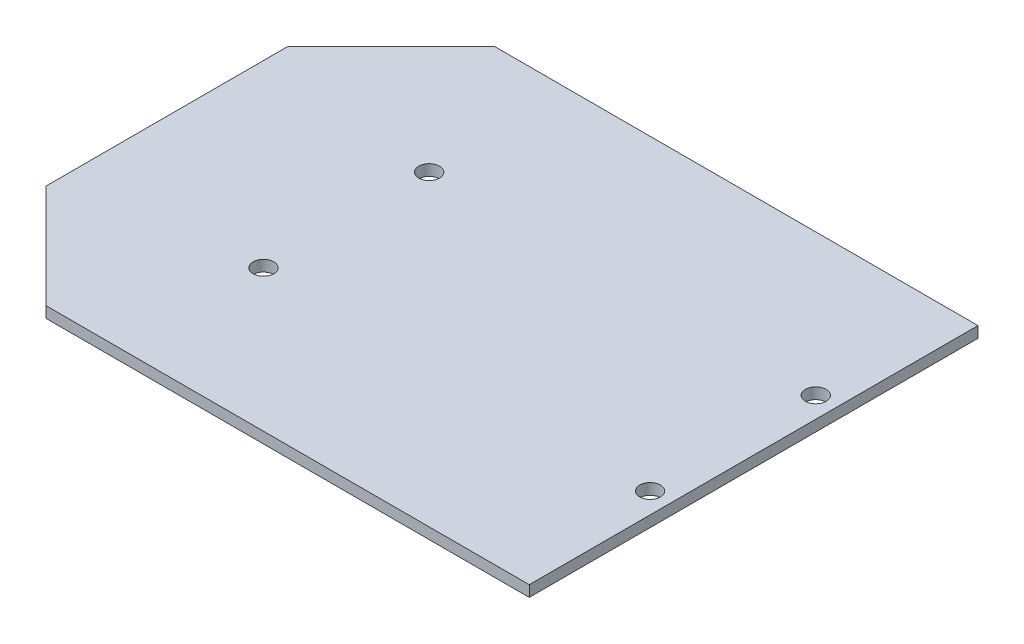
ISO-10303-21;
HEADER;
FILE_DESCRIPTION(('STEP AP214'),'2;1');
FILE_NAME('part.step','',(''),(''),'','','');
FILE_SCHEMA(('AUTOMOTIVE_DESIGN { 1 0 10303 214 1 1 1 1 }'));
ENDSEC;
DATA;
#1=APPLICATION_CONTEXT('core data for automotive mechanical design processes');
#2=APPLICATION_PROTOCOL_DEFINITION('international standard','automotive_design',2000,#1);
#3=PRODUCT_CONTEXT('',#1,'mechanical');
#4=PRODUCT('Part','Part','',(#3));
#5=PRODUCT_RELATED_PRODUCT_CATEGORY('part','',(#4));
#6=PRODUCT_DEFINITION_FORMATION('','',#4);
#7=PRODUCT_DEFINITION_CONTEXT('part definition',#1,'design');
#8=PRODUCT_DEFINITION('design','',#6,#7);
#9=PRODUCT_DEFINITION_SHAPE('','',#8);
#10=(LENGTH_UNIT() NAMED_UNIT(*) SI_UNIT(.MILLI.,.METRE.));
#11=(NAMED_UNIT(*) PLANE_ANGLE_UNIT() SI_UNIT($,.RADIAN.));
#12=(NAMED_UNIT(*) SI_UNIT($,.STERADIAN.) SOLID_ANGLE_UNIT());
#13=UNCERTAINTY_MEASURE_WITH_UNIT(LENGTH_MEASURE(1.E-05),#10,'distance_accuracy_value','');
#14=(GEOMETRIC_REPRESENTATION_CONTEXT(3) GLOBAL_UNCERTAINTY_ASSIGNED_CONTEXT((#13)) GLOBAL_UNIT_ASSIGNED_CONTEXT((#10,
#11,#12)) REPRESENTATION_CONTEXT('',''));
#15=CARTESIAN_POINT('',(0.,0.,0.));
#16=DIRECTION('',(0.,0.,1.));
#17=DIRECTION('',(1.,0.,0.));
#18=AXIS2_PLACEMENT_3D('',#15,#16,#17);
#19=CARTESIAN_POINT('',(42.5,1.6,32.5));
#20=DIRECTION('',(-1.,0.,0.));
#21=DIRECTION('',(0.,0.,1.));
#22=AXIS2_PLACEMENT_3D('',#19,#20,#21);
#23=PLANE('',#22);
#24=DIRECTION('',(0.,0.,-1.));
#25=VECTOR('',#24,1.);
#26=CARTESIAN_POINT('',(42.5,0.,32.5));
#27=LINE('',#26,#25);
#28=CARTESIAN_POINT('',(42.5,0.,32.5));
#29=VERTEX_POINT('',#28);
#30=CARTESIAN_POINT('',(42.5,0.,-32.5));
#31=VERTEX_POINT('',#30);
#32=EDGE_CURVE('E122',#29,#31,#27,.T.);
#33=ORIENTED_EDGE('',*,*,#32,.T.);
#34=DIRECTION('',(0.,-1.,0.));
#35=VECTOR('',#34,1.);
#36=CARTESIAN_POINT('',(42.5,1.6,-32.5));
#37=LINE('',#36,#35);
#38=CARTESIAN_POINT('',(42.5,1.6,-32.5));
#39=VERTEX_POINT('',#38);
#40=EDGE_CURVE('E11',#39,#31,#37,.T.);
#41=ORIENTED_EDGE('',*,*,#40,.F.);
#42=DIRECTION('',(0.,0.,-1.));
#43=VECTOR('',#42,1.);
#44=CARTESIAN_POINT('',(42.5,1.6,32.5));
#45=LINE('',#44,#43);
#46=CARTESIAN_POINT('',(42.5,1.6,32.5));
#47=VERTEX_POINT('',#46);
#48=EDGE_CURVE('E120',#47,#39,#45,.T.);
#49=ORIENTED_EDGE('',*,*,#48,.F.);
#50=DIRECTION('',(0.,-1.,0.));
#51=VECTOR('',#50,1.);
#52=CARTESIAN_POINT('',(42.5,1.6,32.5));
#53=LINE('',#52,#51);
#54=EDGE_CURVE('E49',#47,#29,#53,.T.);
#55=ORIENTED_EDGE('',*,*,#54,.T.);
#56=EDGE_LOOP('',(#33,#41,#49,#55));
#57=FACE_BOUND('',#56,.T.);
#58=ADVANCED_FACE('F41',(#57),#23,.F.);
#59=CARTESIAN_POINT('',(-42.5,1.6,-32.5));
#60=DIRECTION('',(0.,0.,1.));
#61=DIRECTION('',(1.,0.,0.));
#62=AXIS2_PLACEMENT_3D('',#59,#60,#61);
#63=PLANE('',#62);
#64=DIRECTION('',(-1.,0.,0.));
#65=VECTOR('',#64,1.);
#66=CARTESIAN_POINT('',(-42.5,0.,-32.5));
#67=LINE('',#66,#65);
#68=CARTESIAN_POINT('',(-27.5,0.,-32.5));
#69=VERTEX_POINT('',#68);
#70=EDGE_CURVE('E116',#31,#69,#67,.T.);
#71=ORIENTED_EDGE('',*,*,#70,.T.);
#72=DIRECTION('',(0.,-1.,0.));
#73=VECTOR('',#72,1.);
#74=CARTESIAN_POINT('',(-27.5,10.,-32.5));
#75=LINE('',#74,#73);
#76=CARTESIAN_POINT('',(-27.5,1.6,-32.5));
#77=VERTEX_POINT('',#76);
#78=EDGE_CURVE('E56',#77,#69,#75,.T.);
#79=ORIENTED_EDGE('',*,*,#78,.F.);
#80=DIRECTION('',(-1.,0.,0.));
#81=VECTOR('',#80,1.);
#82=CARTESIAN_POINT('',(-42.5,1.6,-32.5));
#83=LINE('',#82,#81);
#84=EDGE_CURVE('E140',#39,#77,#83,.T.);
#85=ORIENTED_EDGE('',*,*,#84,.F.);
#86=ORIENTED_EDGE('',*,*,#40,.T.);
#87=EDGE_LOOP('',(#71,#79,#85,#86));
#88=FACE_BOUND('',#87,.T.);
#89=ADVANCED_FACE('F157',(#88),#63,.F.);
#90=CARTESIAN_POINT('',(-42.5,1.6,32.5));
#91=DIRECTION('',(1.,0.,0.));
#92=DIRECTION('',(0.,0.,-1.));
#93=AXIS2_PLACEMENT_3D('',#90,#91,#92);
#94=PLANE('',#93);
#95=DIRECTION('',(0.,0.,1.));
#96=VECTOR('',#95,1.);
#97=CARTESIAN_POINT('',(-42.5,1.6,32.5));
#98=LINE('',#97,#96);
#99=CARTESIAN_POINT('',(-42.5,1.6,-17.5));
#100=VERTEX_POINT('',#99);
#101=CARTESIAN_POINT('',(-42.5,1.6,17.5));
#102=VERTEX_POINT('',#101);
#103=EDGE_CURVE('E107',#100,#102,#98,.T.);
#104=ORIENTED_EDGE('',*,*,#103,.F.);
#105=DIRECTION('',(0.,-1.,0.));
#106=VECTOR('',#105,1.);
#107=CARTESIAN_POINT('',(-42.5,10.,-17.5));
#108=LINE('',#107,#106);
#109=CARTESIAN_POINT('',(-42.5,0.,-17.5));
#110=VERTEX_POINT('',#109);
#111=EDGE_CURVE('E94',#100,#110,#108,.T.);
#112=ORIENTED_EDGE('',*,*,#111,.T.);
#113=DIRECTION('',(0.,0.,1.));
#114=VECTOR('',#113,1.);
#115=CARTESIAN_POINT('',(-42.5,0.,32.5));
#116=LINE('',#115,#114);
#117=CARTESIAN_POINT('',(-42.5,0.,17.5));
#118=VERTEX_POINT('',#117);
#119=EDGE_CURVE('E105',#110,#118,#116,.T.);
#120=ORIENTED_EDGE('',*,*,#119,.T.);
#121=DIRECTION('',(0.,-1.,0.));
#122=VECTOR('',#121,1.);
#123=CARTESIAN_POINT('',(-42.5,10.,17.5));
#124=LINE('',#123,#122);
#125=EDGE_CURVE('E64',#102,#118,#124,.T.);
#126=ORIENTED_EDGE('',*,*,#125,.F.);
#127=EDGE_LOOP('',(#104,#112,#120,#126));
#128=FACE_BOUND('',#127,.T.);
#129=ADVANCED_FACE('F104',(#128),#94,.F.);
#130=CARTESIAN_POINT('',(-42.5,1.6,32.5));
#131=DIRECTION('',(0.,0.,-1.));
#132=DIRECTION('',(-1.,0.,0.));
#133=AXIS2_PLACEMENT_3D('',#130,#131,#132);
#134=PLANE('',#133);
#135=DIRECTION('',(1.,0.,0.));
#136=VECTOR('',#135,1.);
#137=CARTESIAN_POINT('',(-42.5,1.6,32.5));
#138=LINE('',#137,#136);
#139=CARTESIAN_POINT('',(-27.5,1.6,32.5));
#140=VERTEX_POINT('',#139);
#141=EDGE_CURVE('E127',#140,#47,#138,.T.);
#142=ORIENTED_EDGE('',*,*,#141,.F.);
#143=DIRECTION('',(0.,-1.,0.));
#144=VECTOR('',#143,1.);
#145=CARTESIAN_POINT('',(-27.5,10.,32.5));
#146=LINE('',#145,#144);
#147=CARTESIAN_POINT('',(-27.5,0.,32.5));
#148=VERTEX_POINT('',#147);
#149=EDGE_CURVE('E163',#140,#148,#146,.T.);
#150=ORIENTED_EDGE('',*,*,#149,.T.);
#151=DIRECTION('',(1.,0.,0.));
#152=VECTOR('',#151,1.);
#153=CARTESIAN_POINT('',(-42.5,0.,32.5));
#154=LINE('',#153,#152);
#155=EDGE_CURVE('E115',#148,#29,#154,.T.);
#156=ORIENTED_EDGE('',*,*,#155,.T.);
#157=ORIENTED_EDGE('',*,*,#54,.F.);
#158=EDGE_LOOP('',(#142,#150,#156,#157));
#159=FACE_BOUND('',#158,.T.);
#160=ADVANCED_FACE('F169',(#159),#134,.F.);
#161=CARTESIAN_POINT('',(0.,1.6,0.));
#162=DIRECTION('',(0.,-1.,0.));
#163=DIRECTION('',(0.,0.,-1.));
#164=AXIS2_PLACEMENT_3D('',#161,#162,#163);
#165=PLANE('',#164);
#166=CARTESIAN_POINT('',(-16.5,1.6,-12.));
#167=DIRECTION('',(0.,-1.,0.));
#168=DIRECTION('',(0.,0.,-1.));
#169=AXIS2_PLACEMENT_3D('',#166,#167,#168);
#170=CIRCLE('',#169,1.49999999999999);
#171=CARTESIAN_POINT('',(-16.5,1.6,-13.5));
#172=VERTEX_POINT('',#171);
#173=EDGE_CURVE('E164',#172,#172,#170,.T.);
#174=ORIENTED_EDGE('',*,*,#173,.T.);
#175=EDGE_LOOP('',(#174));
#176=FACE_BOUND('',#175,.T.);
#177=CARTESIAN_POINT('',(39.5,1.6,-12.));
#178=DIRECTION('',(0.,-1.,0.));
#179=DIRECTION('',(0.,0.,-1.));
#180=AXIS2_PLACEMENT_3D('',#177,#178,#179);
#181=CIRCLE('',#180,1.5);
#182=CARTESIAN_POINT('',(39.5,1.6,-13.5));
#183=VERTEX_POINT('',#182);
#184=EDGE_CURVE('E202',#183,#183,#181,.T.);
#185=ORIENTED_EDGE('',*,*,#184,.T.);
#186=EDGE_LOOP('',(#185));
#187=FACE_BOUND('',#186,.T.);
#188=CARTESIAN_POINT('',(39.5000000000004,1.6,12.));
#189=DIRECTION('',(0.,-1.,0.));
#190=DIRECTION('',(0.,0.,-1.));
#191=AXIS2_PLACEMENT_3D('',#188,#189,#190);
#192=CIRCLE('',#191,1.5);
#193=CARTESIAN_POINT('',(39.5000000000004,1.6,10.5));
#194=VERTEX_POINT('',#193);
#195=EDGE_CURVE('E206',#194,#194,#192,.T.);
#196=ORIENTED_EDGE('',*,*,#195,.T.);
#197=EDGE_LOOP('',(#196));
#198=FACE_BOUND('',#197,.T.);
#199=CARTESIAN_POINT('',(-16.5,1.6,12.));
#200=DIRECTION('',(0.,-1.,0.));
#201=DIRECTION('',(0.,0.,-1.));
#202=AXIS2_PLACEMENT_3D('',#199,#200,#201);
#203=CIRCLE('',#202,1.49999999999999);
#204=CARTESIAN_POINT('',(-16.5,1.6,10.5));
#205=VERTEX_POINT('',#204);
#206=EDGE_CURVE('E209',#205,#205,#203,.T.);
#207=ORIENTED_EDGE('',*,*,#206,.T.);
#208=EDGE_LOOP('',(#207));
#209=FACE_BOUND('',#208,.T.);
#210=ORIENTED_EDGE('',*,*,#84,.T.);
#211=DIRECTION('',(-0.707106781186548,0.,0.707106781186548));
#212=VECTOR('',#211,1.);
#213=CARTESIAN_POINT('',(-30.,1.6,-30.));
#214=LINE('',#213,#212);
#215=EDGE_CURVE('E144',#77,#100,#214,.T.);
#216=ORIENTED_EDGE('',*,*,#215,.T.);
#217=ORIENTED_EDGE('',*,*,#103,.T.);
#218=DIRECTION('',(0.707106781186548,0.,0.707106781186548));
#219=VECTOR('',#218,1.);
#220=CARTESIAN_POINT('',(-30.,1.6,30.));
#221=LINE('',#220,#219);
#222=EDGE_CURVE('E109',#102,#140,#221,.T.);
#223=ORIENTED_EDGE('',*,*,#222,.T.);
#224=ORIENTED_EDGE('',*,*,#141,.T.);
#225=ORIENTED_EDGE('',*,*,#48,.T.);
#226=EDGE_LOOP('',(#210,#216,#217,#223,#224,#225));
#227=FACE_BOUND('',#226,.T.);
#228=ADVANCED_FACE('F155',(#176,#187,#198,#209,#227),#165,.F.);
#229=CARTESIAN_POINT('',(0.,0.,0.));
#230=DIRECTION('',(0.,-1.,0.));
#231=DIRECTION('',(0.,0.,-1.));
#232=AXIS2_PLACEMENT_3D('',#229,#230,#231);
#233=PLANE('',#232);
#234=CARTESIAN_POINT('',(-16.5,0.,-12.));
#235=DIRECTION('',(0.,-1.,0.));
#236=DIRECTION('',(0.,0.,1.));
#237=AXIS2_PLACEMENT_3D('',#234,#235,#236);
#238=CIRCLE('',#237,1.49999999999999);
#239=CARTESIAN_POINT('',(-16.5,0.,-10.5));
#240=VERTEX_POINT('',#239);
#241=EDGE_CURVE('E225',#240,#240,#238,.T.);
#242=ORIENTED_EDGE('',*,*,#241,.F.);
#243=EDGE_LOOP('',(#242));
#244=FACE_BOUND('',#243,.T.);
#245=CARTESIAN_POINT('',(39.5,0.,-12.));
#246=DIRECTION('',(0.,-1.,0.));
#247=DIRECTION('',(0.,0.,-1.));
#248=AXIS2_PLACEMENT_3D('',#245,#246,#247);
#249=CIRCLE('',#248,1.5);
#250=CARTESIAN_POINT('',(39.5,0.,-13.5));
#251=VERTEX_POINT('',#250);
#252=EDGE_CURVE('E229',#251,#251,#249,.T.);
#253=ORIENTED_EDGE('',*,*,#252,.F.);
#254=EDGE_LOOP('',(#253));
#255=FACE_BOUND('',#254,.T.);
#256=CARTESIAN_POINT('',(39.5000000000004,0.,12.));
#257=DIRECTION('',(0.,-1.,0.));
#258=DIRECTION('',(0.,0.,-1.));
#259=AXIS2_PLACEMENT_3D('',#256,#257,#258);
#260=CIRCLE('',#259,1.5);
#261=CARTESIAN_POINT('',(39.5000000000004,0.,10.5));
#262=VERTEX_POINT('',#261);
#263=EDGE_CURVE('E218',#262,#262,#260,.T.);
#264=ORIENTED_EDGE('',*,*,#263,.F.);
#265=EDGE_LOOP('',(#264));
#266=FACE_BOUND('',#265,.T.);
#267=CARTESIAN_POINT('',(-16.5,0.,12.));
#268=DIRECTION('',(0.,-1.,0.));
#269=DIRECTION('',(0.,0.,-1.));
#270=AXIS2_PLACEMENT_3D('',#267,#268,#269);
#271=CIRCLE('',#270,1.49999999999999);
#272=CARTESIAN_POINT('',(-16.5,0.,10.5));
#273=VERTEX_POINT('',#272);
#274=EDGE_CURVE('E212',#273,#273,#271,.T.);
#275=ORIENTED_EDGE('',*,*,#274,.F.);
#276=EDGE_LOOP('',(#275));
#277=FACE_BOUND('',#276,.T.);
#278=DIRECTION('',(-0.707106781186547,0.,0.707106781186547));
#279=VECTOR('',#278,1.);
#280=CARTESIAN_POINT('',(-42.5,0.,-17.5));
#281=LINE('',#280,#279);
#282=EDGE_CURVE('E91',#69,#110,#281,.T.);
#283=ORIENTED_EDGE('',*,*,#282,.F.);
#284=ORIENTED_EDGE('',*,*,#70,.F.);
#285=ORIENTED_EDGE('',*,*,#32,.F.);
#286=ORIENTED_EDGE('',*,*,#155,.F.);
#287=DIRECTION('',(0.707106781186547,0.,0.707106781186547));
#288=VECTOR('',#287,1.);
#289=CARTESIAN_POINT('',(-42.5,0.,17.5));
#290=LINE('',#289,#288);
#291=EDGE_CURVE('E113',#118,#148,#290,.T.);
#292=ORIENTED_EDGE('',*,*,#291,.F.);
#293=ORIENTED_EDGE('',*,*,#119,.F.);
#294=EDGE_LOOP('',(#283,#284,#285,#286,#292,#293));
#295=FACE_BOUND('',#294,.T.);
#296=ADVANCED_FACE('F111',(#244,#255,#266,#277,#295),#233,.T.);
#297=CARTESIAN_POINT('',(-42.5,10.,17.5));
#298=DIRECTION('',(0.707106781186548,0.,-0.707106781186548));
#299=DIRECTION('',(-0.707106781186548,0.,-0.707106781186548));
#300=AXIS2_PLACEMENT_3D('',#297,#298,#299);
#301=PLANE('',#300);
#302=ORIENTED_EDGE('',*,*,#125,.T.);
#303=ORIENTED_EDGE('',*,*,#291,.T.);
#304=ORIENTED_EDGE('',*,*,#149,.F.);
#305=ORIENTED_EDGE('',*,*,#222,.F.);
#306=EDGE_LOOP('',(#302,#303,#304,#305));
#307=FACE_BOUND('',#306,.T.);
#308=ADVANCED_FACE('F170',(#307),#301,.F.);
#309=CARTESIAN_POINT('',(-42.5,10.,-17.5));
#310=DIRECTION('',(0.707106781186548,0.,0.707106781186548));
#311=DIRECTION('',(0.707106781186548,0.,-0.707106781186548));
#312=AXIS2_PLACEMENT_3D('',#309,#310,#311);
#313=PLANE('',#312);
#314=ORIENTED_EDGE('',*,*,#78,.T.);
#315=ORIENTED_EDGE('',*,*,#282,.T.);
#316=ORIENTED_EDGE('',*,*,#111,.F.);
#317=ORIENTED_EDGE('',*,*,#215,.F.);
#318=EDGE_LOOP('',(#314,#315,#316,#317));
#319=FACE_BOUND('',#318,.T.);
#320=ADVANCED_FACE('F93',(#319),#313,.F.);
#321=CARTESIAN_POINT('',(-16.5,16.,12.));
#322=DIRECTION('',(0.,-1.,0.));
#323=DIRECTION('',(0.,0.,-1.));
#324=AXIS2_PLACEMENT_3D('',#321,#322,#323);
#325=CYLINDRICAL_SURFACE('',#324,1.49999999999999);
#326=ORIENTED_EDGE('',*,*,#274,.T.);
#327=EDGE_LOOP('',(#326));
#328=FACE_BOUND('',#327,.T.);
#329=ORIENTED_EDGE('',*,*,#206,.F.);
#330=EDGE_LOOP('',(#329));
#331=FACE_BOUND('',#330,.T.);
#332=ADVANCED_FACE('F177',(#328,#331),#325,.F.);
#333=CARTESIAN_POINT('',(39.5000000000004,16.,12.));
#334=DIRECTION('',(0.,-1.,0.));
#335=DIRECTION('',(0.,0.,-1.));
#336=AXIS2_PLACEMENT_3D('',#333,#334,#335);
#337=CYLINDRICAL_SURFACE('',#336,1.5);
#338=ORIENTED_EDGE('',*,*,#263,.T.);
#339=EDGE_LOOP('',(#338));
#340=FACE_BOUND('',#339,.T.);
#341=ORIENTED_EDGE('',*,*,#195,.F.);
#342=EDGE_LOOP('',(#341));
#343=FACE_BOUND('',#342,.T.);
#344=ADVANCED_FACE('F237',(#340,#343),#337,.F.);
#345=CARTESIAN_POINT('',(39.5,16.,-12.));
#346=DIRECTION('',(0.,-1.,0.));
#347=DIRECTION('',(0.,0.,-1.));
#348=AXIS2_PLACEMENT_3D('',#345,#346,#347);
#349=CYLINDRICAL_SURFACE('',#348,1.5);
#350=ORIENTED_EDGE('',*,*,#252,.T.);
#351=EDGE_LOOP('',(#350));
#352=FACE_BOUND('',#351,.T.);
#353=ORIENTED_EDGE('',*,*,#184,.F.);
#354=EDGE_LOOP('',(#353));
#355=FACE_BOUND('',#354,.T.);
#356=ADVANCED_FACE('F248',(#352,#355),#349,.F.);
#357=CARTESIAN_POINT('',(-16.5,16.,-12.));
#358=DIRECTION('',(0.,-1.,0.));
#359=DIRECTION('',(0.,0.,-1.));
#360=AXIS2_PLACEMENT_3D('',#357,#358,#359);
#361=CYLINDRICAL_SURFACE('',#360,1.49999999999999);
#362=ORIENTED_EDGE('',*,*,#241,.T.);
#363=EDGE_LOOP('',(#362));
#364=FACE_BOUND('',#363,.T.);
#365=ORIENTED_EDGE('',*,*,#173,.F.);
#366=EDGE_LOOP('',(#365));
#367=FACE_BOUND('',#366,.T.);
#368=ADVANCED_FACE('F251',(#364,#367),#361,.F.);
#369=CLOSED_SHELL('',(#58,#89,#129,#160,#228,#296,#308,#320,#332,#344,#356,#368));
#370=MANIFOLD_SOLID_BREP('B2',#369);
#371=ADVANCED_BREP_SHAPE_REPRESENTATION('',(#18,#370),#14);
#372=SHAPE_DEFINITION_REPRESENTATION(#9,#371);
ENDSEC;
END-ISO-10303-21;
